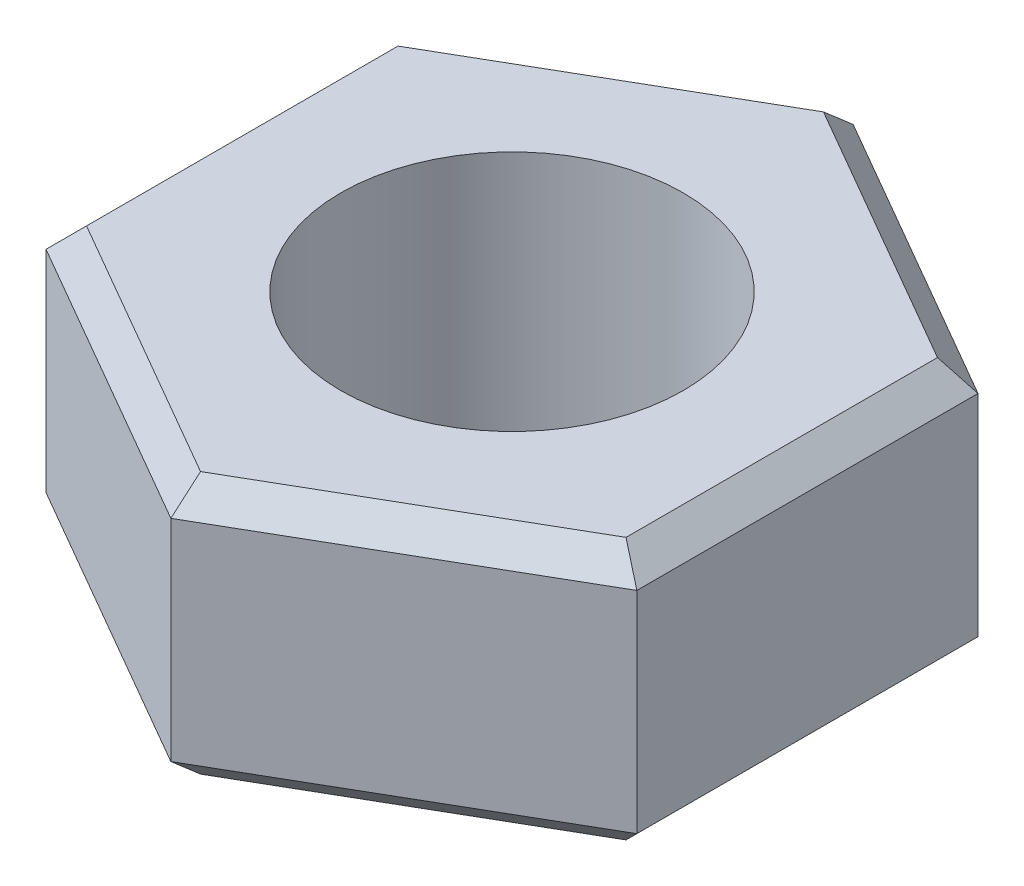
ISO-10303-21;
HEADER;
FILE_DESCRIPTION(('STEP AP214'),'2;1');
FILE_NAME('part.step','',(''),(''),'','','');
FILE_SCHEMA(('AUTOMOTIVE_DESIGN { 1 0 10303 214 1 1 1 1 }'));
ENDSEC;
DATA;
#1=APPLICATION_CONTEXT('core data for automotive mechanical design processes');
#2=APPLICATION_PROTOCOL_DEFINITION('international standard','automotive_design',2000,#1);
#3=PRODUCT_CONTEXT('',#1,'mechanical');
#4=PRODUCT('Part','Part','',(#3));
#5=PRODUCT_RELATED_PRODUCT_CATEGORY('part','',(#4));
#6=PRODUCT_DEFINITION_FORMATION('','',#4);
#7=PRODUCT_DEFINITION_CONTEXT('part definition',#1,'design');
#8=PRODUCT_DEFINITION('design','',#6,#7);
#9=PRODUCT_DEFINITION_SHAPE('','',#8);
#10=(LENGTH_UNIT() NAMED_UNIT(*) SI_UNIT(.MILLI.,.METRE.));
#11=(NAMED_UNIT(*) PLANE_ANGLE_UNIT() SI_UNIT($,.RADIAN.));
#12=(NAMED_UNIT(*) SI_UNIT($,.STERADIAN.) SOLID_ANGLE_UNIT());
#13=UNCERTAINTY_MEASURE_WITH_UNIT(LENGTH_MEASURE(1.E-05),#10,'distance_accuracy_value','');
#14=(GEOMETRIC_REPRESENTATION_CONTEXT(3) GLOBAL_UNCERTAINTY_ASSIGNED_CONTEXT((#13)) GLOBAL_UNIT_ASSIGNED_CONTEXT((#10,
#11,#12)) REPRESENTATION_CONTEXT('',''));
#15=CARTESIAN_POINT('',(0.,0.,0.));
#16=DIRECTION('',(0.,0.,1.));
#17=DIRECTION('',(1.,0.,0.));
#18=AXIS2_PLACEMENT_3D('',#15,#16,#17);
#19=CARTESIAN_POINT('',(0.,3.06,0.));
#20=DIRECTION('',(0.,1.,0.));
#21=DIRECTION('',(0.,0.,1.));
#22=AXIS2_PLACEMENT_3D('',#19,#20,#21);
#23=PLANE('',#22);
#24=DIRECTION('',(0.866025403784435,0.,-0.500000000000007));
#25=VECTOR('',#24,1.);
#26=CARTESIAN_POINT('',(3.30000000000002,3.06,1.73205080756885));
#27=LINE('',#26,#25);
#28=CARTESIAN_POINT('',(0.,3.06,3.63730669589465));
#29=VERTEX_POINT('',#28);
#30=CARTESIAN_POINT('',(3.15000000000002,3.06,1.81865334794729));
#31=VERTEX_POINT('',#30);
#32=EDGE_CURVE('E149',#29,#31,#27,.T.);
#33=ORIENTED_EDGE('',*,*,#32,.T.);
#34=DIRECTION('',(0.,0.,-1.));
#35=VECTOR('',#34,1.);
#36=CARTESIAN_POINT('',(3.14999999999998,3.06,-1.99185842870425));
#37=LINE('',#36,#35);
#38=CARTESIAN_POINT('',(3.14999999999998,3.06,-1.81865334794736));
#39=VERTEX_POINT('',#38);
#40=EDGE_CURVE('E130',#31,#39,#37,.T.);
#41=ORIENTED_EDGE('',*,*,#40,.T.);
#42=DIRECTION('',(-0.866025403784442,0.,-0.499999999999995));
#43=VECTOR('',#42,1.);
#44=CARTESIAN_POINT('',(-0.149999999999997,3.06,-3.72390923627309));
#45=LINE('',#44,#43);
#46=CARTESIAN_POINT('',(0.,3.06,-3.63730669589465));
#47=VERTEX_POINT('',#46);
#48=EDGE_CURVE('E138',#39,#47,#45,.T.);
#49=ORIENTED_EDGE('',*,*,#48,.T.);
#50=DIRECTION('',(-0.866025403784438,0.,0.500000000000001));
#51=VECTOR('',#50,1.);
#52=CARTESIAN_POINT('',(-3.30000000000001,3.06,-1.73205080756887));
#53=LINE('',#52,#51);
#54=CARTESIAN_POINT('',(-3.15000000000001,3.06,-1.81865334794732));
#55=VERTEX_POINT('',#54);
#56=EDGE_CURVE('E144',#47,#55,#53,.T.);
#57=ORIENTED_EDGE('',*,*,#56,.T.);
#58=DIRECTION('',(0.,0.,1.));
#59=VECTOR('',#58,1.);
#60=CARTESIAN_POINT('',(-3.15,3.06,1.99185842870423));
#61=LINE('',#60,#59);
#62=CARTESIAN_POINT('',(-3.15,3.06,1.81865334794734));
#63=VERTEX_POINT('',#62);
#64=EDGE_CURVE('E251',#55,#63,#61,.T.);
#65=ORIENTED_EDGE('',*,*,#64,.T.);
#66=DIRECTION('',(0.866025403784442,0.,0.499999999999995));
#67=VECTOR('',#66,1.);
#68=CARTESIAN_POINT('',(0.150000000000025,3.06,3.72390923627309));
#69=LINE('',#68,#67);
#70=EDGE_CURVE('E154',#63,#29,#69,.T.);
#71=ORIENTED_EDGE('',*,*,#70,.T.);
#72=EDGE_LOOP('',(#33,#41,#49,#57,#65,#71));
#73=FACE_BOUND('',#72,.T.);
#74=CARTESIAN_POINT('',(0.,3.06,0.));
#75=DIRECTION('',(0.,1.,0.));
#76=DIRECTION('',(0.,0.,1.));
#77=AXIS2_PLACEMENT_3D('',#74,#75,#76);
#78=CIRCLE('',#77,2.);
#79=CARTESIAN_POINT('',(0.,3.06,2.));
#80=VERTEX_POINT('',#79);
#81=EDGE_CURVE('E274',#80,#80,#78,.T.);
#82=ORIENTED_EDGE('',*,*,#81,.F.);
#83=EDGE_LOOP('',(#82));
#84=FACE_BOUND('',#83,.T.);
#85=ADVANCED_FACE('F36',(#73,#84),#23,.T.);
#86=CARTESIAN_POINT('',(0.,0.,0.));
#87=DIRECTION('',(0.,1.,0.));
#88=DIRECTION('',(0.,0.,1.));
#89=AXIS2_PLACEMENT_3D('',#86,#87,#88);
#90=PLANE('',#89);
#91=DIRECTION('',(0.,0.,-1.));
#92=VECTOR('',#91,1.);
#93=CARTESIAN_POINT('',(-3.15,0.,0.));
#94=LINE('',#93,#92);
#95=CARTESIAN_POINT('',(-3.14999999999999,0.,1.81865334794734));
#96=VERTEX_POINT('',#95);
#97=CARTESIAN_POINT('',(-3.15,0.,-1.81865334794732));
#98=VERTEX_POINT('',#97);
#99=EDGE_CURVE('E45',#96,#98,#94,.T.);
#100=ORIENTED_EDGE('',*,*,#99,.T.);
#101=DIRECTION('',(0.866025403784438,0.,-0.500000000000001));
#102=VECTOR('',#101,1.);
#103=CARTESIAN_POINT('',(-1.575,0.,-2.72798002192098));
#104=LINE('',#103,#102);
#105=CARTESIAN_POINT('',(0.,0.,-3.63730669589464));
#106=VERTEX_POINT('',#105);
#107=EDGE_CURVE('E11',#98,#106,#104,.T.);
#108=ORIENTED_EDGE('',*,*,#107,.T.);
#109=DIRECTION('',(0.866025403784442,0.,0.499999999999995));
#110=VECTOR('',#109,1.);
#111=CARTESIAN_POINT('',(1.57499999999999,0.,-2.727980021921));
#112=LINE('',#111,#110);
#113=CARTESIAN_POINT('',(3.14999999999998,0.,-1.81865334794736));
#114=VERTEX_POINT('',#113);
#115=EDGE_CURVE('E180',#106,#114,#112,.T.);
#116=ORIENTED_EDGE('',*,*,#115,.T.);
#117=DIRECTION('',(0.,0.,1.));
#118=VECTOR('',#117,1.);
#119=CARTESIAN_POINT('',(3.15,0.,0.));
#120=LINE('',#119,#118);
#121=CARTESIAN_POINT('',(3.15000000000002,0.,1.81865334794729));
#122=VERTEX_POINT('',#121);
#123=EDGE_CURVE('E182',#114,#122,#120,.T.);
#124=ORIENTED_EDGE('',*,*,#123,.T.);
#125=DIRECTION('',(-0.866025403784435,0.,0.500000000000007));
#126=VECTOR('',#125,1.);
#127=CARTESIAN_POINT('',(1.57500000000002,0.,2.72798002192097));
#128=LINE('',#127,#126);
#129=CARTESIAN_POINT('',(0.,0.,3.63730669589464));
#130=VERTEX_POINT('',#129);
#131=EDGE_CURVE('E184',#122,#130,#128,.T.);
#132=ORIENTED_EDGE('',*,*,#131,.T.);
#133=DIRECTION('',(-0.866025403784442,0.,-0.499999999999995));
#134=VECTOR('',#133,1.);
#135=CARTESIAN_POINT('',(-1.57499999999998,0.,2.72798002192099));
#136=LINE('',#135,#134);
#137=EDGE_CURVE('E56',#130,#96,#136,.T.);
#138=ORIENTED_EDGE('',*,*,#137,.T.);
#139=EDGE_LOOP('',(#100,#108,#116,#124,#132,#138));
#140=FACE_BOUND('',#139,.T.);
#141=CARTESIAN_POINT('',(0.,0.,0.));
#142=DIRECTION('',(0.,1.,0.));
#143=DIRECTION('',(0.,0.,1.));
#144=AXIS2_PLACEMENT_3D('',#141,#142,#143);
#145=CIRCLE('',#144,2.);
#146=CARTESIAN_POINT('',(0.,0.,2.));
#147=VERTEX_POINT('',#146);
#148=EDGE_CURVE('E199',#147,#147,#145,.T.);
#149=ORIENTED_EDGE('',*,*,#148,.T.);
#150=EDGE_LOOP('',(#149));
#151=FACE_BOUND('',#150,.T.);
#152=ADVANCED_FACE('F224',(#140,#151),#90,.F.);
#153=CARTESIAN_POINT('',(3.44999999999998,3.06,-1.99185842870425));
#154=DIRECTION('',(-0.499999999999995,0.,0.866025403784442));
#155=DIRECTION('',(0.866025403784441,0.,0.499999999999995));
#156=AXIS2_PLACEMENT_3D('',#153,#154,#155);
#157=PLANE('',#156);
#158=DIRECTION('',(0.,-1.,0.));
#159=VECTOR('',#158,1.);
#160=CARTESIAN_POINT('',(0.,3.06,-3.98371685740842));
#161=LINE('',#160,#159);
#162=CARTESIAN_POINT('',(0.,2.76,-3.98371685740842));
#163=VERTEX_POINT('',#162);
#164=CARTESIAN_POINT('',(0.,0.300000000000001,-3.98371685740842));
#165=VERTEX_POINT('',#164);
#166=EDGE_CURVE('E145',#163,#165,#161,.T.);
#167=ORIENTED_EDGE('',*,*,#166,.F.);
#168=DIRECTION('',(0.866025403784441,0.,0.499999999999995));
#169=VECTOR('',#168,1.);
#170=CARTESIAN_POINT('',(3.44999999999998,2.76,-1.99185842870425));
#171=LINE('',#170,#169);
#172=CARTESIAN_POINT('',(3.44999999999998,2.76,-1.99185842870425));
#173=VERTEX_POINT('',#172);
#174=EDGE_CURVE('E178',#163,#173,#171,.T.);
#175=ORIENTED_EDGE('',*,*,#174,.T.);
#176=DIRECTION('',(0.,-1.,0.));
#177=VECTOR('',#176,1.);
#178=CARTESIAN_POINT('',(3.44999999999998,3.06,-1.99185842870425));
#179=LINE('',#178,#177);
#180=CARTESIAN_POINT('',(3.44999999999998,0.300000000000001,-1.99185842870425));
#181=VERTEX_POINT('',#180);
#182=EDGE_CURVE('E238',#173,#181,#179,.T.);
#183=ORIENTED_EDGE('',*,*,#182,.T.);
#184=DIRECTION('',(-0.866025403784441,0.,-0.499999999999995));
#185=VECTOR('',#184,1.);
#186=CARTESIAN_POINT('',(3.44999999999998,0.300000000000001,-1.99185842870425));
#187=LINE('',#186,#185);
#188=EDGE_CURVE('E176',#181,#165,#187,.T.);
#189=ORIENTED_EDGE('',*,*,#188,.T.);
#190=EDGE_LOOP('',(#167,#175,#183,#189));
#191=FACE_BOUND('',#190,.T.);
#192=ADVANCED_FACE('F236',(#191),#157,.F.);
#193=CARTESIAN_POINT('',(0.,3.06,-3.98371685740842));
#194=DIRECTION('',(0.500000000000001,0.,0.866025403784438));
#195=DIRECTION('',(0.866025403784438,0.,-0.500000000000001));
#196=AXIS2_PLACEMENT_3D('',#193,#194,#195);
#197=PLANE('',#196);
#198=DIRECTION('',(0.,-1.,0.));
#199=VECTOR('',#198,1.);
#200=CARTESIAN_POINT('',(-3.45000000000001,3.06,-1.9918584287042));
#201=LINE('',#200,#199);
#202=CARTESIAN_POINT('',(-3.45000000000001,2.76,-1.9918584287042));
#203=VERTEX_POINT('',#202);
#204=CARTESIAN_POINT('',(-3.45000000000001,0.300000000000002,-1.9918584287042));
#205=VERTEX_POINT('',#204);
#206=EDGE_CURVE('E244',#203,#205,#201,.T.);
#207=ORIENTED_EDGE('',*,*,#206,.F.);
#208=DIRECTION('',(0.866025403784438,0.,-0.500000000000001));
#209=VECTOR('',#208,1.);
#210=CARTESIAN_POINT('',(0.,2.76,-3.98371685740842));
#211=LINE('',#210,#209);
#212=EDGE_CURVE('E174',#203,#163,#211,.T.);
#213=ORIENTED_EDGE('',*,*,#212,.T.);
#214=ORIENTED_EDGE('',*,*,#166,.T.);
#215=DIRECTION('',(-0.866025403784438,0.,0.500000000000001));
#216=VECTOR('',#215,1.);
#217=CARTESIAN_POINT('',(0.,0.300000000000001,-3.98371685740842));
#218=LINE('',#217,#216);
#219=EDGE_CURVE('E171',#165,#205,#218,.T.);
#220=ORIENTED_EDGE('',*,*,#219,.T.);
#221=EDGE_LOOP('',(#207,#213,#214,#220));
#222=FACE_BOUND('',#221,.T.);
#223=ADVANCED_FACE('F241',(#222),#197,.F.);
#224=CARTESIAN_POINT('',(-3.45000000000001,3.06,-1.9918584287042));
#225=DIRECTION('',(1.,0.,0.));
#226=DIRECTION('',(0.,0.,-1.));
#227=AXIS2_PLACEMENT_3D('',#224,#225,#226);
#228=PLANE('',#227);
#229=DIRECTION('',(0.,-1.,0.));
#230=VECTOR('',#229,1.);
#231=CARTESIAN_POINT('',(-3.44999999999999,3.06,1.99185842870423));
#232=LINE('',#231,#230);
#233=CARTESIAN_POINT('',(-3.44999999999999,2.76,1.99185842870423));
#234=VERTEX_POINT('',#233);
#235=CARTESIAN_POINT('',(-3.44999999999999,0.300000000000002,1.99185842870423));
#236=VERTEX_POINT('',#235);
#237=EDGE_CURVE('E246',#234,#236,#232,.T.);
#238=ORIENTED_EDGE('',*,*,#237,.F.);
#239=DIRECTION('',(0.,0.,-1.));
#240=VECTOR('',#239,1.);
#241=CARTESIAN_POINT('',(-3.45000000000001,2.76,-1.9918584287042));
#242=LINE('',#241,#240);
#243=EDGE_CURVE('E169',#234,#203,#242,.T.);
#244=ORIENTED_EDGE('',*,*,#243,.T.);
#245=ORIENTED_EDGE('',*,*,#206,.T.);
#246=DIRECTION('',(0.,0.,1.));
#247=VECTOR('',#246,1.);
#248=CARTESIAN_POINT('',(-3.45000000000001,0.300000000000002,-1.9918584287042));
#249=LINE('',#248,#247);
#250=EDGE_CURVE('E167',#205,#236,#249,.T.);
#251=ORIENTED_EDGE('',*,*,#250,.T.);
#252=EDGE_LOOP('',(#238,#244,#245,#251));
#253=FACE_BOUND('',#252,.T.);
#254=ADVANCED_FACE('F312',(#253),#228,.F.);
#255=CARTESIAN_POINT('',(-3.44999999999999,3.06,1.99185842870423));
#256=DIRECTION('',(0.499999999999995,0.,-0.866025403784442));
#257=DIRECTION('',(-0.866025403784442,0.,-0.499999999999995));
#258=AXIS2_PLACEMENT_3D('',#255,#256,#257);
#259=PLANE('',#258);
#260=DIRECTION('',(0.,-1.,0.));
#261=VECTOR('',#260,1.);
#262=CARTESIAN_POINT('',(0.,3.06,3.98371685740842));
#263=LINE('',#262,#261);
#264=CARTESIAN_POINT('',(0.,2.76,3.98371685740842));
#265=VERTEX_POINT('',#264);
#266=CARTESIAN_POINT('',(0.,0.300000000000001,3.98371685740842));
#267=VERTEX_POINT('',#266);
#268=EDGE_CURVE('E271',#265,#267,#263,.T.);
#269=ORIENTED_EDGE('',*,*,#268,.F.);
#270=DIRECTION('',(-0.866025403784442,0.,-0.499999999999995));
#271=VECTOR('',#270,1.);
#272=CARTESIAN_POINT('',(-3.44999999999999,2.76,1.99185842870423));
#273=LINE('',#272,#271);
#274=EDGE_CURVE('E165',#265,#234,#273,.T.);
#275=ORIENTED_EDGE('',*,*,#274,.T.);
#276=ORIENTED_EDGE('',*,*,#237,.T.);
#277=DIRECTION('',(0.866025403784442,0.,0.499999999999995));
#278=VECTOR('',#277,1.);
#279=CARTESIAN_POINT('',(-3.44999999999999,0.300000000000002,1.99185842870423));
#280=LINE('',#279,#278);
#281=EDGE_CURVE('E163',#236,#267,#280,.T.);
#282=ORIENTED_EDGE('',*,*,#281,.T.);
#283=EDGE_LOOP('',(#269,#275,#276,#282));
#284=FACE_BOUND('',#283,.T.);
#285=ADVANCED_FACE('F280',(#284),#259,.F.);
#286=CARTESIAN_POINT('',(0.,3.06,3.98371685740842));
#287=DIRECTION('',(-0.500000000000007,0.,-0.866025403784435));
#288=DIRECTION('',(-0.866025403784435,0.,0.500000000000007));
#289=AXIS2_PLACEMENT_3D('',#286,#287,#288);
#290=PLANE('',#289);
#291=DIRECTION('',(0.,-1.,0.));
#292=VECTOR('',#291,1.);
#293=CARTESIAN_POINT('',(3.45000000000002,3.06,1.99185842870418));
#294=LINE('',#293,#292);
#295=CARTESIAN_POINT('',(3.45000000000002,2.76,1.99185842870418));
#296=VERTEX_POINT('',#295);
#297=CARTESIAN_POINT('',(3.45000000000002,0.300000000000002,1.99185842870418));
#298=VERTEX_POINT('',#297);
#299=EDGE_CURVE('E269',#296,#298,#294,.T.);
#300=ORIENTED_EDGE('',*,*,#299,.F.);
#301=DIRECTION('',(-0.866025403784435,0.,0.500000000000007));
#302=VECTOR('',#301,1.);
#303=CARTESIAN_POINT('',(0.,2.76,3.98371685740842));
#304=LINE('',#303,#302);
#305=EDGE_CURVE('E161',#296,#265,#304,.T.);
#306=ORIENTED_EDGE('',*,*,#305,.T.);
#307=ORIENTED_EDGE('',*,*,#268,.T.);
#308=DIRECTION('',(0.866025403784435,0.,-0.500000000000007));
#309=VECTOR('',#308,1.);
#310=CARTESIAN_POINT('',(0.,0.300000000000001,3.98371685740842));
#311=LINE('',#310,#309);
#312=EDGE_CURVE('E159',#267,#298,#311,.T.);
#313=ORIENTED_EDGE('',*,*,#312,.T.);
#314=EDGE_LOOP('',(#300,#306,#307,#313));
#315=FACE_BOUND('',#314,.T.);
#316=ADVANCED_FACE('F270',(#315),#290,.F.);
#317=CARTESIAN_POINT('',(3.45000000000002,3.06,1.99185842870418));
#318=DIRECTION('',(-1.,0.,0.));
#319=DIRECTION('',(0.,0.,1.));
#320=AXIS2_PLACEMENT_3D('',#317,#318,#319);
#321=PLANE('',#320);
#322=ORIENTED_EDGE('',*,*,#182,.F.);
#323=DIRECTION('',(0.,0.,1.));
#324=VECTOR('',#323,1.);
#325=CARTESIAN_POINT('',(3.45000000000002,2.76,1.99185842870418));
#326=LINE('',#325,#324);
#327=EDGE_CURVE('E132',#173,#296,#326,.T.);
#328=ORIENTED_EDGE('',*,*,#327,.T.);
#329=ORIENTED_EDGE('',*,*,#299,.T.);
#330=DIRECTION('',(0.,0.,-1.));
#331=VECTOR('',#330,1.);
#332=CARTESIAN_POINT('',(3.45000000000002,0.300000000000002,1.99185842870418));
#333=LINE('',#332,#331);
#334=EDGE_CURVE('E151',#298,#181,#333,.T.);
#335=ORIENTED_EDGE('',*,*,#334,.T.);
#336=EDGE_LOOP('',(#322,#328,#329,#335));
#337=FACE_BOUND('',#336,.T.);
#338=ADVANCED_FACE('F268',(#337),#321,.F.);
#339=CARTESIAN_POINT('',(0.,3.06,0.));
#340=DIRECTION('',(0.,-1.,0.));
#341=DIRECTION('',(0.,0.,-1.));
#342=AXIS2_PLACEMENT_3D('',#339,#340,#341);
#343=CYLINDRICAL_SURFACE('',#342,2.);
#344=ORIENTED_EDGE('',*,*,#81,.T.);
#345=EDGE_LOOP('',(#344));
#346=FACE_BOUND('',#345,.T.);
#347=ORIENTED_EDGE('',*,*,#148,.F.);
#348=EDGE_LOOP('',(#347));
#349=FACE_BOUND('',#348,.T.);
#350=ADVANCED_FACE('F304',(#346,#349),#343,.F.);
#351=CARTESIAN_POINT('',(-3.15,3.06,0.));
#352=DIRECTION('',(-0.70710678118655,0.707106781186545,0.));
#353=DIRECTION('',(0.,0.,-1.));
#354=AXIS2_PLACEMENT_3D('',#351,#352,#353);
#355=PLANE('',#354);
#356=DIRECTION('',(0.654653670707976,0.654653670707979,0.377964473009225));
#357=VECTOR('',#356,1.);
#358=CARTESIAN_POINT('',(-2.70000000000001,3.51,-1.55884572681199));
#359=LINE('',#358,#357);
#360=EDGE_CURVE('E193',#203,#55,#359,.T.);
#361=ORIENTED_EDGE('',*,*,#360,.F.);
#362=ORIENTED_EDGE('',*,*,#243,.F.);
#363=DIRECTION('',(0.654653670707974,0.654653670707979,-0.377964473009229));
#364=VECTOR('',#363,1.);
#365=CARTESIAN_POINT('',(-2.7,3.51,1.55884572681201));
#366=LINE('',#365,#364);
#367=EDGE_CURVE('E196',#63,#234,#366,.F.);
#368=ORIENTED_EDGE('',*,*,#367,.F.);
#369=ORIENTED_EDGE('',*,*,#64,.F.);
#370=EDGE_LOOP('',(#361,#362,#368,#369));
#371=FACE_BOUND('',#370,.T.);
#372=ADVANCED_FACE('F330',(#371),#355,.T.);
#373=CARTESIAN_POINT('',(-1.57499999999999,3.06,2.72798002192099));
#374=DIRECTION('',(-0.353553390593271,0.707106781186545,0.612372435695799));
#375=DIRECTION('',(-0.866025403784442,0.,-0.499999999999995));
#376=AXIS2_PLACEMENT_3D('',#373,#374,#375);
#377=PLANE('',#376);
#378=ORIENTED_EDGE('',*,*,#367,.T.);
#379=ORIENTED_EDGE('',*,*,#274,.F.);
#380=DIRECTION('',(0.,0.654653670707979,-0.755928946018453));
#381=VECTOR('',#380,1.);
#382=CARTESIAN_POINT('',(0.,3.51000000000001,3.11769145362398));
#383=LINE('',#382,#381);
#384=EDGE_CURVE('E190',#29,#265,#383,.F.);
#385=ORIENTED_EDGE('',*,*,#384,.F.);
#386=ORIENTED_EDGE('',*,*,#70,.F.);
#387=EDGE_LOOP('',(#378,#379,#385,#386));
#388=FACE_BOUND('',#387,.T.);
#389=ADVANCED_FACE('F258',(#388),#377,.T.);
#390=CARTESIAN_POINT('',(-1.575,3.06,-2.72798002192098));
#391=DIRECTION('',(-0.353553390593276,0.707106781186545,-0.612372435695796));
#392=DIRECTION('',(0.866025403784438,0.,-0.500000000000001));
#393=AXIS2_PLACEMENT_3D('',#390,#391,#392);
#394=PLANE('',#393);
#395=ORIENTED_EDGE('',*,*,#360,.T.);
#396=ORIENTED_EDGE('',*,*,#56,.F.);
#397=DIRECTION('',(0.,0.65465367070798,0.755928946018452));
#398=VECTOR('',#397,1.);
#399=CARTESIAN_POINT('',(0.,3.51,-3.117691453624));
#400=LINE('',#399,#398);
#401=EDGE_CURVE('E141',#163,#47,#400,.T.);
#402=ORIENTED_EDGE('',*,*,#401,.F.);
#403=ORIENTED_EDGE('',*,*,#212,.F.);
#404=EDGE_LOOP('',(#395,#396,#402,#403));
#405=FACE_BOUND('',#404,.T.);
#406=ADVANCED_FACE('F325',(#405),#394,.T.);
#407=CARTESIAN_POINT('',(1.57500000000002,3.06,2.72798002192097));
#408=DIRECTION('',(0.353553390593279,0.707106781186547,0.612372435695792));
#409=DIRECTION('',(-0.866025403784435,0.,0.500000000000007));
#410=AXIS2_PLACEMENT_3D('',#407,#408,#409);
#411=PLANE('',#410);
#412=ORIENTED_EDGE('',*,*,#384,.T.);
#413=ORIENTED_EDGE('',*,*,#305,.F.);
#414=DIRECTION('',(-0.654653670707978,0.654653670707979,-0.377964473009223));
#415=VECTOR('',#414,1.);
#416=CARTESIAN_POINT('',(2.70000000000002,3.51,1.55884572681197));
#417=LINE('',#416,#415);
#418=EDGE_CURVE('E135',#31,#296,#417,.F.);
#419=ORIENTED_EDGE('',*,*,#418,.F.);
#420=ORIENTED_EDGE('',*,*,#32,.F.);
#421=EDGE_LOOP('',(#412,#413,#419,#420));
#422=FACE_BOUND('',#421,.T.);
#423=ADVANCED_FACE('F261',(#422),#411,.T.);
#424=CARTESIAN_POINT('',(1.57499999999999,3.06,-2.72798002192101));
#425=DIRECTION('',(0.353553390593271,0.707106781186545,-0.612372435695799));
#426=DIRECTION('',(0.866025403784441,0.,0.499999999999995));
#427=AXIS2_PLACEMENT_3D('',#424,#425,#426);
#428=PLANE('',#427);
#429=ORIENTED_EDGE('',*,*,#401,.T.);
#430=ORIENTED_EDGE('',*,*,#48,.F.);
#431=DIRECTION('',(0.654653670707972,-0.65465367070798,-0.377964473009231));
#432=VECTOR('',#431,1.);
#433=CARTESIAN_POINT('',(2.69999999999999,3.51,-1.55884572681203));
#434=LINE('',#433,#432);
#435=EDGE_CURVE('E126',#173,#39,#434,.F.);
#436=ORIENTED_EDGE('',*,*,#435,.F.);
#437=ORIENTED_EDGE('',*,*,#174,.F.);
#438=EDGE_LOOP('',(#429,#430,#436,#437));
#439=FACE_BOUND('',#438,.T.);
#440=ADVANCED_FACE('F139',(#439),#428,.T.);
#441=CARTESIAN_POINT('',(3.15,3.06,0.));
#442=DIRECTION('',(0.70710678118655,0.707106781186545,0.));
#443=DIRECTION('',(0.,0.,1.));
#444=AXIS2_PLACEMENT_3D('',#441,#442,#443);
#445=PLANE('',#444);
#446=ORIENTED_EDGE('',*,*,#418,.T.);
#447=ORIENTED_EDGE('',*,*,#327,.F.);
#448=ORIENTED_EDGE('',*,*,#435,.T.);
#449=ORIENTED_EDGE('',*,*,#40,.F.);
#450=EDGE_LOOP('',(#446,#447,#448,#449));
#451=FACE_BOUND('',#450,.T.);
#452=ADVANCED_FACE('F128',(#451),#445,.T.);
#453=CARTESIAN_POINT('',(0.,0.300000000000002,3.98371685740842));
#454=DIRECTION('',(-0.353553390593278,0.707106781186549,-0.612372435695791));
#455=DIRECTION('',(0.866025403784435,0.,-0.500000000000007));
#456=AXIS2_PLACEMENT_3D('',#453,#454,#455);
#457=PLANE('',#456);
#458=DIRECTION('',(0.,-0.654653670707976,-0.755928946018455));
#459=VECTOR('',#458,1.);
#460=CARTESIAN_POINT('',(0.,0.300000000000002,3.98371685740842));
#461=LINE('',#460,#459);
#462=EDGE_CURVE('E209',#130,#267,#461,.F.);
#463=ORIENTED_EDGE('',*,*,#462,.F.);
#464=ORIENTED_EDGE('',*,*,#131,.F.);
#465=DIRECTION('',(-0.65465367070798,-0.654653670707977,-0.377964473009224));
#466=VECTOR('',#465,1.);
#467=CARTESIAN_POINT('',(3.45000000000002,0.300000000000002,1.99185842870418));
#468=LINE('',#467,#466);
#469=EDGE_CURVE('E40',#298,#122,#468,.T.);
#470=ORIENTED_EDGE('',*,*,#469,.F.);
#471=ORIENTED_EDGE('',*,*,#312,.F.);
#472=EDGE_LOOP('',(#463,#464,#470,#471));
#473=FACE_BOUND('',#472,.T.);
#474=ADVANCED_FACE('F38',(#473),#457,.F.);
#475=CARTESIAN_POINT('',(3.45000000000002,0.300000000000002,1.99185842870418));
#476=DIRECTION('',(-0.707106781186548,0.707106781186547,0.));
#477=DIRECTION('',(0.,0.,-1.));
#478=AXIS2_PLACEMENT_3D('',#475,#476,#477);
#479=PLANE('',#478);
#480=ORIENTED_EDGE('',*,*,#469,.T.);
#481=ORIENTED_EDGE('',*,*,#123,.F.);
#482=DIRECTION('',(-0.654653670707973,-0.654653670707977,0.377964473009234));
#483=VECTOR('',#482,1.);
#484=CARTESIAN_POINT('',(3.44999999999998,0.300000000000002,-1.99185842870425));
#485=LINE('',#484,#483);
#486=EDGE_CURVE('E207',#181,#114,#485,.T.);
#487=ORIENTED_EDGE('',*,*,#486,.F.);
#488=ORIENTED_EDGE('',*,*,#334,.F.);
#489=EDGE_LOOP('',(#480,#481,#487,#488));
#490=FACE_BOUND('',#489,.T.);
#491=ADVANCED_FACE('F219',(#490),#479,.F.);
#492=CARTESIAN_POINT('',(-3.44999999999999,0.300000000000002,1.99185842870423));
#493=DIRECTION('',(0.35355339059327,0.707106781186548,-0.612372435695796));
#494=DIRECTION('',(0.866025403784442,0.,0.499999999999995));
#495=AXIS2_PLACEMENT_3D('',#492,#493,#494);
#496=PLANE('',#495);
#497=ORIENTED_EDGE('',*,*,#462,.T.);
#498=ORIENTED_EDGE('',*,*,#281,.F.);
#499=DIRECTION('',(0.654653670707976,-0.654653670707976,-0.377964473009231));
#500=VECTOR('',#499,1.);
#501=CARTESIAN_POINT('',(-3.44999999999999,0.300000000000002,1.99185842870423));
#502=LINE('',#501,#500);
#503=EDGE_CURVE('E204',#96,#236,#502,.F.);
#504=ORIENTED_EDGE('',*,*,#503,.F.);
#505=ORIENTED_EDGE('',*,*,#137,.F.);
#506=EDGE_LOOP('',(#497,#498,#504,#505));
#507=FACE_BOUND('',#506,.T.);
#508=ADVANCED_FACE('F283',(#507),#496,.F.);
#509=CARTESIAN_POINT('',(3.44999999999998,0.300000000000002,-1.99185842870425));
#510=DIRECTION('',(-0.35355339059327,0.707106781186548,0.612372435695796));
#511=DIRECTION('',(-0.866025403784441,0.,-0.499999999999995));
#512=AXIS2_PLACEMENT_3D('',#509,#510,#511);
#513=PLANE('',#512);
#514=ORIENTED_EDGE('',*,*,#486,.T.);
#515=ORIENTED_EDGE('',*,*,#115,.F.);
#516=DIRECTION('',(0.,0.654653670707977,-0.755928946018454));
#517=VECTOR('',#516,1.);
#518=CARTESIAN_POINT('',(0.,-0.685714285714268,-2.84551204100604));
#519=LINE('',#518,#517);
#520=EDGE_CURVE('E202',#165,#106,#519,.F.);
#521=ORIENTED_EDGE('',*,*,#520,.F.);
#522=ORIENTED_EDGE('',*,*,#188,.F.);
#523=EDGE_LOOP('',(#514,#515,#521,#522));
#524=FACE_BOUND('',#523,.T.);
#525=ADVANCED_FACE('F229',(#524),#513,.F.);
#526=CARTESIAN_POINT('',(-3.45000000000001,0.300000000000002,-1.9918584287042));
#527=DIRECTION('',(0.707106781186547,0.707106781186548,0.));
#528=DIRECTION('',(0.,0.,1.));
#529=AXIS2_PLACEMENT_3D('',#526,#527,#528);
#530=PLANE('',#529);
#531=ORIENTED_EDGE('',*,*,#503,.T.);
#532=ORIENTED_EDGE('',*,*,#250,.F.);
#533=DIRECTION('',(0.654653670707979,-0.654653670707977,0.377964473009224));
#534=VECTOR('',#533,1.);
#535=CARTESIAN_POINT('',(-3.45000000000001,0.300000000000002,-1.9918584287042));
#536=LINE('',#535,#534);
#537=EDGE_CURVE('E200',#98,#205,#536,.F.);
#538=ORIENTED_EDGE('',*,*,#537,.F.);
#539=ORIENTED_EDGE('',*,*,#99,.F.);
#540=EDGE_LOOP('',(#531,#532,#538,#539));
#541=FACE_BOUND('',#540,.T.);
#542=ADVANCED_FACE('F286',(#541),#530,.F.);
#543=CARTESIAN_POINT('',(0.,0.300000000000002,-3.98371685740842));
#544=DIRECTION('',(0.353553390593275,0.707106781186547,0.612372435695794));
#545=DIRECTION('',(-0.866025403784438,0.,0.500000000000001));
#546=AXIS2_PLACEMENT_3D('',#543,#544,#545);
#547=PLANE('',#546);
#548=ORIENTED_EDGE('',*,*,#520,.T.);
#549=ORIENTED_EDGE('',*,*,#107,.F.);
#550=ORIENTED_EDGE('',*,*,#537,.T.);
#551=ORIENTED_EDGE('',*,*,#219,.F.);
#552=EDGE_LOOP('',(#548,#549,#550,#551));
#553=FACE_BOUND('',#552,.T.);
#554=ADVANCED_FACE('F289',(#553),#547,.F.);
#555=CLOSED_SHELL('',(#85,#152,#192,#223,#254,#285,#316,#338,#350,#372,#389,#406,#423,#440,#452,
#474,#491,#508,#525,#542,#554));
#556=MANIFOLD_SOLID_BREP('B2',#555);
#557=ADVANCED_BREP_SHAPE_REPRESENTATION('',(#18,#556),#14);
#558=SHAPE_DEFINITION_REPRESENTATION(#9,#557);
ENDSEC;
END-ISO-10303-21;
